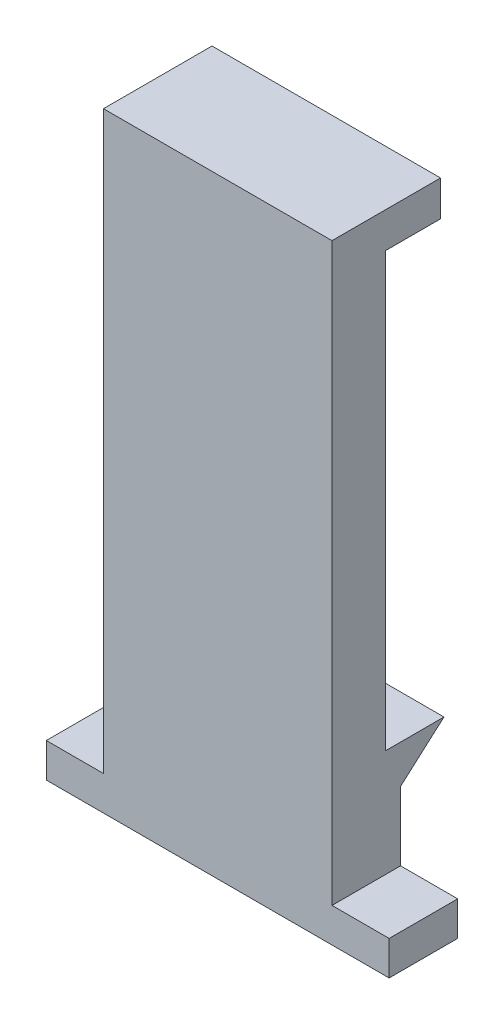
ISO-10303-21;
HEADER;
FILE_DESCRIPTION(('STEP AP214'),'2;1');
FILE_NAME('part.step','',(''),(''),'','','');
FILE_SCHEMA(('AUTOMOTIVE_DESIGN { 1 0 10303 214 1 1 1 1 }'));
ENDSEC;
DATA;
#1=APPLICATION_CONTEXT('core data for automotive mechanical design processes');
#2=APPLICATION_PROTOCOL_DEFINITION('international standard','automotive_design',2000,#1);
#3=PRODUCT_CONTEXT('',#1,'mechanical');
#4=PRODUCT('Part','Part','',(#3));
#5=PRODUCT_RELATED_PRODUCT_CATEGORY('part','',(#4));
#6=PRODUCT_DEFINITION_FORMATION('','',#4);
#7=PRODUCT_DEFINITION_CONTEXT('part definition',#1,'design');
#8=PRODUCT_DEFINITION('design','',#6,#7);
#9=PRODUCT_DEFINITION_SHAPE('','',#8);
#10=(LENGTH_UNIT() NAMED_UNIT(*) SI_UNIT(.MILLI.,.METRE.));
#11=(NAMED_UNIT(*) PLANE_ANGLE_UNIT() SI_UNIT($,.RADIAN.));
#12=(NAMED_UNIT(*) SI_UNIT($,.STERADIAN.) SOLID_ANGLE_UNIT());
#13=UNCERTAINTY_MEASURE_WITH_UNIT(LENGTH_MEASURE(1.E-05),#10,'distance_accuracy_value','');
#14=(GEOMETRIC_REPRESENTATION_CONTEXT(3) GLOBAL_UNCERTAINTY_ASSIGNED_CONTEXT((#13)) GLOBAL_UNIT_ASSIGNED_CONTEXT((#10,
#11,#12)) REPRESENTATION_CONTEXT('',''));
#15=CARTESIAN_POINT('',(0.,0.,0.));
#16=DIRECTION('',(0.,0.,1.));
#17=DIRECTION('',(1.,0.,0.));
#18=AXIS2_PLACEMENT_3D('',#15,#16,#17);
#19=CARTESIAN_POINT('',(20.,41.,0.300000000000007));
#20=DIRECTION('',(0.,-1.,0.));
#21=DIRECTION('',(0.,0.,-1.));
#22=AXIS2_PLACEMENT_3D('',#19,#20,#21);
#23=PLANE('',#22);
#24=DIRECTION('',(0.,0.,1.));
#25=VECTOR('',#24,1.);
#26=CARTESIAN_POINT('',(0.,41.,0.300000000000007));
#27=LINE('',#26,#25);
#28=CARTESIAN_POINT('',(0.,41.,0.300000000000007));
#29=VERTEX_POINT('',#28);
#30=CARTESIAN_POINT('',(0.,41.,9.80000000000001));
#31=VERTEX_POINT('',#30);
#32=EDGE_CURVE('E166',#29,#31,#27,.T.);
#33=ORIENTED_EDGE('',*,*,#32,.T.);
#34=DIRECTION('',(-1.,0.,0.));
#35=VECTOR('',#34,1.);
#36=CARTESIAN_POINT('',(20.,41.,9.80000000000001));
#37=LINE('',#36,#35);
#38=CARTESIAN_POINT('',(20.,41.,9.80000000000001));
#39=VERTEX_POINT('',#38);
#40=EDGE_CURVE('E46',#39,#31,#37,.T.);
#41=ORIENTED_EDGE('',*,*,#40,.F.);
#42=DIRECTION('',(0.,0.,1.));
#43=VECTOR('',#42,1.);
#44=CARTESIAN_POINT('',(20.,41.,0.300000000000007));
#45=LINE('',#44,#43);
#46=CARTESIAN_POINT('',(20.,41.,0.300000000000007));
#47=VERTEX_POINT('',#46);
#48=EDGE_CURVE('E168',#47,#39,#45,.T.);
#49=ORIENTED_EDGE('',*,*,#48,.F.);
#50=DIRECTION('',(-1.,0.,0.));
#51=VECTOR('',#50,1.);
#52=CARTESIAN_POINT('',(20.,41.,0.300000000000007));
#53=LINE('',#52,#51);
#54=EDGE_CURVE('E183',#47,#29,#53,.T.);
#55=ORIENTED_EDGE('',*,*,#54,.T.);
#56=EDGE_LOOP('',(#33,#41,#49,#55));
#57=FACE_BOUND('',#56,.T.);
#58=ADVANCED_FACE('F39',(#57),#23,.F.);
#59=CARTESIAN_POINT('',(20.,41.,9.80000000000001));
#60=DIRECTION('',(0.,0.,-1.));
#61=DIRECTION('',(0.,1.,0.));
#62=AXIS2_PLACEMENT_3D('',#59,#60,#61);
#63=PLANE('',#62);
#64=DIRECTION('',(0.,-1.,0.));
#65=VECTOR('',#64,1.);
#66=CARTESIAN_POINT('',(0.,41.,9.80000000000001));
#67=LINE('',#66,#65);
#68=CARTESIAN_POINT('',(0.,-9.38,9.8));
#69=VERTEX_POINT('',#68);
#70=EDGE_CURVE('E186',#31,#69,#67,.T.);
#71=ORIENTED_EDGE('',*,*,#70,.T.);
#72=DIRECTION('',(1.,0.,0.));
#73=VECTOR('',#72,1.);
#74=CARTESIAN_POINT('',(-5.,-9.38,9.8));
#75=LINE('',#74,#73);
#76=CARTESIAN_POINT('',(-5.,-9.38,9.8));
#77=VERTEX_POINT('',#76);
#78=EDGE_CURVE('E161',#77,#69,#75,.T.);
#79=ORIENTED_EDGE('',*,*,#78,.F.);
#80=DIRECTION('',(0.,-1.,0.));
#81=VECTOR('',#80,1.);
#82=CARTESIAN_POINT('',(-5.,-9.38,9.8));
#83=LINE('',#82,#81);
#84=CARTESIAN_POINT('',(-5.,-12.38,9.8));
#85=VERTEX_POINT('',#84);
#86=EDGE_CURVE('E158',#77,#85,#83,.T.);
#87=ORIENTED_EDGE('',*,*,#86,.T.);
#88=DIRECTION('',(-1.,0.,0.));
#89=VECTOR('',#88,1.);
#90=CARTESIAN_POINT('',(20.,-12.38,9.8));
#91=LINE('',#90,#89);
#92=CARTESIAN_POINT('',(25.,-12.38,9.8));
#93=VERTEX_POINT('',#92);
#94=EDGE_CURVE('E219',#93,#85,#91,.T.);
#95=ORIENTED_EDGE('',*,*,#94,.F.);
#96=DIRECTION('',(0.,-1.,0.));
#97=VECTOR('',#96,1.);
#98=CARTESIAN_POINT('',(25.,-9.38,9.8));
#99=LINE('',#98,#97);
#100=CARTESIAN_POINT('',(25.,-9.38,9.8));
#101=VERTEX_POINT('',#100);
#102=EDGE_CURVE('E155',#101,#93,#99,.T.);
#103=ORIENTED_EDGE('',*,*,#102,.F.);
#104=CARTESIAN_POINT('',(20.,-9.37999999999999,9.8));
#105=VERTEX_POINT('',#104);
#106=EDGE_CURVE('E147',#105,#101,#75,.T.);
#107=ORIENTED_EDGE('',*,*,#106,.F.);
#108=DIRECTION('',(0.,-1.,0.));
#109=VECTOR('',#108,1.);
#110=CARTESIAN_POINT('',(20.,41.,9.80000000000001));
#111=LINE('',#110,#109);
#112=EDGE_CURVE('E58',#39,#105,#111,.T.);
#113=ORIENTED_EDGE('',*,*,#112,.F.);
#114=ORIENTED_EDGE('',*,*,#40,.T.);
#115=EDGE_LOOP('',(#71,#79,#87,#95,#103,#107,#113,#114));
#116=FACE_BOUND('',#115,.T.);
#117=ADVANCED_FACE('F223',(#116),#63,.F.);
#118=CARTESIAN_POINT('',(20.,-12.38,9.8));
#119=DIRECTION('',(0.,1.,0.));
#120=DIRECTION('',(0.,0.,1.));
#121=AXIS2_PLACEMENT_3D('',#118,#119,#120);
#122=PLANE('',#121);
#123=ORIENTED_EDGE('',*,*,#94,.T.);
#124=DIRECTION('',(0.,0.,-1.));
#125=VECTOR('',#124,1.);
#126=CARTESIAN_POINT('',(-5.,-12.38,9.8));
#127=LINE('',#126,#125);
#128=CARTESIAN_POINT('',(-5.,-12.38,3.8));
#129=VERTEX_POINT('',#128);
#130=EDGE_CURVE('E141',#85,#129,#127,.T.);
#131=ORIENTED_EDGE('',*,*,#130,.T.);
#132=DIRECTION('',(-1.,0.,0.));
#133=VECTOR('',#132,1.);
#134=CARTESIAN_POINT('',(20.,-12.38,3.8));
#135=LINE('',#134,#133);
#136=CARTESIAN_POINT('',(25.,-12.38,3.8));
#137=VERTEX_POINT('',#136);
#138=EDGE_CURVE('E217',#137,#129,#135,.T.);
#139=ORIENTED_EDGE('',*,*,#138,.F.);
#140=DIRECTION('',(0.,0.,-1.));
#141=VECTOR('',#140,1.);
#142=CARTESIAN_POINT('',(25.,-12.38,9.8));
#143=LINE('',#142,#141);
#144=EDGE_CURVE('E154',#93,#137,#143,.T.);
#145=ORIENTED_EDGE('',*,*,#144,.F.);
#146=EDGE_LOOP('',(#123,#131,#139,#145));
#147=FACE_BOUND('',#146,.T.);
#148=ADVANCED_FACE('F251',(#147),#122,.F.);
#149=CARTESIAN_POINT('',(20.,-12.38,3.8));
#150=DIRECTION('',(0.,0.,1.));
#151=DIRECTION('',(0.,-1.,0.));
#152=AXIS2_PLACEMENT_3D('',#149,#150,#151);
#153=PLANE('',#152);
#154=DIRECTION('',(0.,1.,0.));
#155=VECTOR('',#154,1.);
#156=CARTESIAN_POINT('',(20.,-12.38,3.8));
#157=LINE('',#156,#155);
#158=CARTESIAN_POINT('',(20.,-9.38,3.8));
#159=VERTEX_POINT('',#158);
#160=CARTESIAN_POINT('',(20.,-3.3570820663189,3.8));
#161=VERTEX_POINT('',#160);
#162=EDGE_CURVE('E138',#159,#161,#157,.T.);
#163=ORIENTED_EDGE('',*,*,#162,.F.);
#164=DIRECTION('',(1.,0.,0.));
#165=VECTOR('',#164,1.);
#166=CARTESIAN_POINT('',(-5.,-9.38,3.8));
#167=LINE('',#166,#165);
#168=CARTESIAN_POINT('',(25.,-9.38,3.8));
#169=VERTEX_POINT('',#168);
#170=EDGE_CURVE('E131',#159,#169,#167,.T.);
#171=ORIENTED_EDGE('',*,*,#170,.T.);
#172=DIRECTION('',(0.,-1.,0.));
#173=VECTOR('',#172,1.);
#174=CARTESIAN_POINT('',(25.,-9.38,3.8));
#175=LINE('',#174,#173);
#176=EDGE_CURVE('E135',#169,#137,#175,.T.);
#177=ORIENTED_EDGE('',*,*,#176,.T.);
#178=ORIENTED_EDGE('',*,*,#138,.T.);
#179=DIRECTION('',(0.,-1.,0.));
#180=VECTOR('',#179,1.);
#181=CARTESIAN_POINT('',(-5.,-9.38,3.8));
#182=LINE('',#181,#180);
#183=CARTESIAN_POINT('',(-5.,-9.38,3.8));
#184=VERTEX_POINT('',#183);
#185=EDGE_CURVE('E167',#184,#129,#182,.T.);
#186=ORIENTED_EDGE('',*,*,#185,.F.);
#187=CARTESIAN_POINT('',(0.,-9.38,3.8));
#188=VERTEX_POINT('',#187);
#189=EDGE_CURVE('E140',#184,#188,#167,.T.);
#190=ORIENTED_EDGE('',*,*,#189,.T.);
#191=DIRECTION('',(0.,1.,0.));
#192=VECTOR('',#191,1.);
#193=CARTESIAN_POINT('',(0.,-12.38,3.8));
#194=LINE('',#193,#192);
#195=CARTESIAN_POINT('',(0.,-3.3570820663189,3.8));
#196=VERTEX_POINT('',#195);
#197=EDGE_CURVE('E189',#188,#196,#194,.T.);
#198=ORIENTED_EDGE('',*,*,#197,.T.);
#199=DIRECTION('',(-1.,0.,0.));
#200=VECTOR('',#199,1.);
#201=CARTESIAN_POINT('',(20.,-3.3570820663189,3.8));
#202=LINE('',#201,#200);
#203=EDGE_CURVE('E214',#161,#196,#202,.T.);
#204=ORIENTED_EDGE('',*,*,#203,.F.);
#205=EDGE_LOOP('',(#163,#171,#177,#178,#186,#190,#198,#204));
#206=FACE_BOUND('',#205,.T.);
#207=ADVANCED_FACE('F133',(#206),#153,.F.);
#208=CARTESIAN_POINT('',(20.,-3.3570820663189,3.8));
#209=DIRECTION('',(0.,0.749432561175129,0.662080687114861));
#210=DIRECTION('',(0.,-0.662080687114861,0.749432561175129));
#211=AXIS2_PLACEMENT_3D('',#208,#209,#210);
#212=PLANE('',#211);
#213=DIRECTION('',(0.,0.662080687114861,-0.749432561175129));
#214=VECTOR('',#213,1.);
#215=CARTESIAN_POINT('',(0.,-3.3570820663189,3.8));
#216=LINE('',#215,#214);
#217=CARTESIAN_POINT('',(0.,0.,0.));
#218=VERTEX_POINT('',#217);
#219=EDGE_CURVE('E191',#196,#218,#216,.T.);
#220=ORIENTED_EDGE('',*,*,#219,.T.);
#221=DIRECTION('',(-1.,0.,0.));
#222=VECTOR('',#221,1.);
#223=CARTESIAN_POINT('',(20.,0.,0.));
#224=LINE('',#223,#222);
#225=CARTESIAN_POINT('',(20.,0.,0.));
#226=VERTEX_POINT('',#225);
#227=EDGE_CURVE('E211',#226,#218,#224,.T.);
#228=ORIENTED_EDGE('',*,*,#227,.F.);
#229=DIRECTION('',(0.,0.662080687114861,-0.749432561175129));
#230=VECTOR('',#229,1.);
#231=CARTESIAN_POINT('',(20.,-3.3570820663189,3.8));
#232=LINE('',#231,#230);
#233=EDGE_CURVE('E173',#161,#226,#232,.T.);
#234=ORIENTED_EDGE('',*,*,#233,.F.);
#235=ORIENTED_EDGE('',*,*,#203,.T.);
#236=EDGE_LOOP('',(#220,#228,#234,#235));
#237=FACE_BOUND('',#236,.T.);
#238=ADVANCED_FACE('F258',(#237),#212,.F.);
#239=CARTESIAN_POINT('',(20.,0.,0.));
#240=DIRECTION('',(0.,-1.,0.));
#241=DIRECTION('',(0.,0.,-1.));
#242=AXIS2_PLACEMENT_3D('',#239,#240,#241);
#243=PLANE('',#242);
#244=DIRECTION('',(0.,0.,1.));
#245=VECTOR('',#244,1.);
#246=CARTESIAN_POINT('',(0.,0.,0.));
#247=LINE('',#246,#245);
#248=CARTESIAN_POINT('',(0.,0.,5.1));
#249=VERTEX_POINT('',#248);
#250=EDGE_CURVE('E193',#218,#249,#247,.T.);
#251=ORIENTED_EDGE('',*,*,#250,.T.);
#252=DIRECTION('',(-1.,0.,0.));
#253=VECTOR('',#252,1.);
#254=CARTESIAN_POINT('',(20.,0.,5.1));
#255=LINE('',#254,#253);
#256=CARTESIAN_POINT('',(20.,0.,5.1));
#257=VERTEX_POINT('',#256);
#258=EDGE_CURVE('E208',#257,#249,#255,.T.);
#259=ORIENTED_EDGE('',*,*,#258,.F.);
#260=DIRECTION('',(0.,0.,1.));
#261=VECTOR('',#260,1.);
#262=CARTESIAN_POINT('',(20.,0.,0.));
#263=LINE('',#262,#261);
#264=EDGE_CURVE('E175',#226,#257,#263,.T.);
#265=ORIENTED_EDGE('',*,*,#264,.F.);
#266=ORIENTED_EDGE('',*,*,#227,.T.);
#267=EDGE_LOOP('',(#251,#259,#265,#266));
#268=FACE_BOUND('',#267,.T.);
#269=ADVANCED_FACE('F271',(#268),#243,.F.);
#270=CARTESIAN_POINT('',(20.,0.,5.1));
#271=DIRECTION('',(0.,0.,1.));
#272=DIRECTION('',(1.,0.,0.));
#273=AXIS2_PLACEMENT_3D('',#270,#271,#272);
#274=PLANE('',#273);
#275=DIRECTION('',(0.,1.,0.));
#276=VECTOR('',#275,1.);
#277=CARTESIAN_POINT('',(0.,0.,5.1));
#278=LINE('',#277,#276);
#279=CARTESIAN_POINT('',(0.,37.9,5.1));
#280=VERTEX_POINT('',#279);
#281=EDGE_CURVE('E195',#249,#280,#278,.T.);
#282=ORIENTED_EDGE('',*,*,#281,.T.);
#283=DIRECTION('',(-1.,0.,0.));
#284=VECTOR('',#283,1.);
#285=CARTESIAN_POINT('',(20.,37.9,5.1));
#286=LINE('',#285,#284);
#287=CARTESIAN_POINT('',(20.,37.9,5.1));
#288=VERTEX_POINT('',#287);
#289=EDGE_CURVE('E205',#288,#280,#286,.T.);
#290=ORIENTED_EDGE('',*,*,#289,.F.);
#291=DIRECTION('',(0.,1.,0.));
#292=VECTOR('',#291,1.);
#293=CARTESIAN_POINT('',(20.,0.,5.1));
#294=LINE('',#293,#292);
#295=EDGE_CURVE('E177',#257,#288,#294,.T.);
#296=ORIENTED_EDGE('',*,*,#295,.F.);
#297=ORIENTED_EDGE('',*,*,#258,.T.);
#298=EDGE_LOOP('',(#282,#290,#296,#297));
#299=FACE_BOUND('',#298,.T.);
#300=ADVANCED_FACE('F281',(#299),#274,.F.);
#301=CARTESIAN_POINT('',(20.,37.9,5.1));
#302=DIRECTION('',(0.,1.,0.));
#303=DIRECTION('',(0.,0.,1.));
#304=AXIS2_PLACEMENT_3D('',#301,#302,#303);
#305=PLANE('',#304);
#306=DIRECTION('',(0.,0.,-1.));
#307=VECTOR('',#306,1.);
#308=CARTESIAN_POINT('',(0.,37.9,5.1));
#309=LINE('',#308,#307);
#310=CARTESIAN_POINT('',(0.,37.9,0.300000000000007));
#311=VERTEX_POINT('',#310);
#312=EDGE_CURVE('E197',#280,#311,#309,.T.);
#313=ORIENTED_EDGE('',*,*,#312,.T.);
#314=DIRECTION('',(-1.,0.,0.));
#315=VECTOR('',#314,1.);
#316=CARTESIAN_POINT('',(20.,37.9,0.300000000000007));
#317=LINE('',#316,#315);
#318=CARTESIAN_POINT('',(20.,37.9,0.300000000000007));
#319=VERTEX_POINT('',#318);
#320=EDGE_CURVE('E202',#319,#311,#317,.T.);
#321=ORIENTED_EDGE('',*,*,#320,.F.);
#322=DIRECTION('',(0.,0.,-1.));
#323=VECTOR('',#322,1.);
#324=CARTESIAN_POINT('',(20.,37.9,5.1));
#325=LINE('',#324,#323);
#326=EDGE_CURVE('E179',#288,#319,#325,.T.);
#327=ORIENTED_EDGE('',*,*,#326,.F.);
#328=ORIENTED_EDGE('',*,*,#289,.T.);
#329=EDGE_LOOP('',(#313,#321,#327,#328));
#330=FACE_BOUND('',#329,.T.);
#331=ADVANCED_FACE('F290',(#330),#305,.F.);
#332=CARTESIAN_POINT('',(20.,37.9,0.300000000000007));
#333=DIRECTION('',(0.,0.,1.));
#334=DIRECTION('',(1.,0.,0.));
#335=AXIS2_PLACEMENT_3D('',#332,#333,#334);
#336=PLANE('',#335);
#337=DIRECTION('',(0.,1.,0.));
#338=VECTOR('',#337,1.);
#339=CARTESIAN_POINT('',(0.,37.9,0.300000000000007));
#340=LINE('',#339,#338);
#341=EDGE_CURVE('E170',#311,#29,#340,.T.);
#342=ORIENTED_EDGE('',*,*,#341,.T.);
#343=ORIENTED_EDGE('',*,*,#54,.F.);
#344=DIRECTION('',(0.,1.,0.));
#345=VECTOR('',#344,1.);
#346=CARTESIAN_POINT('',(20.,37.9,0.300000000000007));
#347=LINE('',#346,#345);
#348=EDGE_CURVE('E181',#319,#47,#347,.T.);
#349=ORIENTED_EDGE('',*,*,#348,.F.);
#350=ORIENTED_EDGE('',*,*,#320,.T.);
#351=EDGE_LOOP('',(#342,#343,#349,#350));
#352=FACE_BOUND('',#351,.T.);
#353=ADVANCED_FACE('F299',(#352),#336,.F.);
#354=CARTESIAN_POINT('',(20.,0.,0.));
#355=DIRECTION('',(1.,0.,0.));
#356=DIRECTION('',(0.,0.,-1.));
#357=AXIS2_PLACEMENT_3D('',#354,#355,#356);
#358=PLANE('',#357);
#359=DIRECTION('',(0.,0.,1.));
#360=VECTOR('',#359,1.);
#361=CARTESIAN_POINT('',(20.,-9.38,0.));
#362=LINE('',#361,#360);
#363=EDGE_CURVE('E53',#159,#105,#362,.T.);
#364=ORIENTED_EDGE('',*,*,#363,.F.);
#365=ORIENTED_EDGE('',*,*,#162,.T.);
#366=ORIENTED_EDGE('',*,*,#233,.T.);
#367=ORIENTED_EDGE('',*,*,#264,.T.);
#368=ORIENTED_EDGE('',*,*,#295,.T.);
#369=ORIENTED_EDGE('',*,*,#326,.T.);
#370=ORIENTED_EDGE('',*,*,#348,.T.);
#371=ORIENTED_EDGE('',*,*,#48,.T.);
#372=ORIENTED_EDGE('',*,*,#112,.T.);
#373=EDGE_LOOP('',(#364,#365,#366,#367,#368,#369,#370,#371,#372));
#374=FACE_BOUND('',#373,.T.);
#375=ADVANCED_FACE('F307',(#374),#358,.T.);
#376=CARTESIAN_POINT('',(0.,0.,0.));
#377=DIRECTION('',(1.,0.,0.));
#378=DIRECTION('',(0.,0.,-1.));
#379=AXIS2_PLACEMENT_3D('',#376,#377,#378);
#380=PLANE('',#379);
#381=ORIENTED_EDGE('',*,*,#197,.F.);
#382=DIRECTION('',(0.,0.,1.));
#383=VECTOR('',#382,1.);
#384=CARTESIAN_POINT('',(0.,-9.38,0.));
#385=LINE('',#384,#383);
#386=EDGE_CURVE('E11',#188,#69,#385,.T.);
#387=ORIENTED_EDGE('',*,*,#386,.T.);
#388=ORIENTED_EDGE('',*,*,#70,.F.);
#389=ORIENTED_EDGE('',*,*,#32,.F.);
#390=ORIENTED_EDGE('',*,*,#341,.F.);
#391=ORIENTED_EDGE('',*,*,#312,.F.);
#392=ORIENTED_EDGE('',*,*,#281,.F.);
#393=ORIENTED_EDGE('',*,*,#250,.F.);
#394=ORIENTED_EDGE('',*,*,#219,.F.);
#395=EDGE_LOOP('',(#381,#387,#388,#389,#390,#391,#392,#393,#394));
#396=FACE_BOUND('',#395,.T.);
#397=ADVANCED_FACE('F232',(#396),#380,.F.);
#398=CARTESIAN_POINT('',(-5.,-9.38,9.8));
#399=DIRECTION('',(-1.,0.,0.));
#400=DIRECTION('',(0.,0.,1.));
#401=AXIS2_PLACEMENT_3D('',#398,#399,#400);
#402=PLANE('',#401);
#403=ORIENTED_EDGE('',*,*,#130,.F.);
#404=ORIENTED_EDGE('',*,*,#86,.F.);
#405=DIRECTION('',(0.,0.,-1.));
#406=VECTOR('',#405,1.);
#407=CARTESIAN_POINT('',(-5.,-9.38,9.8));
#408=LINE('',#407,#406);
#409=EDGE_CURVE('E156',#77,#184,#408,.T.);
#410=ORIENTED_EDGE('',*,*,#409,.T.);
#411=ORIENTED_EDGE('',*,*,#185,.T.);
#412=EDGE_LOOP('',(#403,#404,#410,#411));
#413=FACE_BOUND('',#412,.T.);
#414=ADVANCED_FACE('F249',(#413),#402,.T.);
#415=CARTESIAN_POINT('',(0.,-9.38,0.));
#416=DIRECTION('',(0.,1.,0.));
#417=DIRECTION('',(0.,0.,1.));
#418=AXIS2_PLACEMENT_3D('',#415,#416,#417);
#419=PLANE('',#418);
#420=ORIENTED_EDGE('',*,*,#386,.F.);
#421=ORIENTED_EDGE('',*,*,#189,.F.);
#422=ORIENTED_EDGE('',*,*,#409,.F.);
#423=ORIENTED_EDGE('',*,*,#78,.T.);
#424=EDGE_LOOP('',(#420,#421,#422,#423));
#425=FACE_BOUND('',#424,.T.);
#426=ADVANCED_FACE('F238',(#425),#419,.T.);
#427=CARTESIAN_POINT('',(25.,-9.38,9.8));
#428=DIRECTION('',(-1.,0.,0.));
#429=DIRECTION('',(0.,0.,1.));
#430=AXIS2_PLACEMENT_3D('',#427,#428,#429);
#431=PLANE('',#430);
#432=ORIENTED_EDGE('',*,*,#144,.T.);
#433=ORIENTED_EDGE('',*,*,#176,.F.);
#434=DIRECTION('',(0.,0.,-1.));
#435=VECTOR('',#434,1.);
#436=CARTESIAN_POINT('',(25.,-9.38,9.8));
#437=LINE('',#436,#435);
#438=EDGE_CURVE('E144',#101,#169,#437,.T.);
#439=ORIENTED_EDGE('',*,*,#438,.F.);
#440=ORIENTED_EDGE('',*,*,#102,.T.);
#441=EDGE_LOOP('',(#432,#433,#439,#440));
#442=FACE_BOUND('',#441,.T.);
#443=ADVANCED_FACE('F152',(#442),#431,.F.);
#444=ORIENTED_EDGE('',*,*,#170,.F.);
#445=ORIENTED_EDGE('',*,*,#363,.T.);
#446=ORIENTED_EDGE('',*,*,#106,.T.);
#447=ORIENTED_EDGE('',*,*,#438,.T.);
#448=EDGE_LOOP('',(#444,#445,#446,#447));
#449=FACE_BOUND('',#448,.T.);
#450=ADVANCED_FACE('F145',(#449),#419,.T.);
#451=CLOSED_SHELL('',(#58,#117,#148,#207,#238,#269,#300,#331,#353,#375,#397,#414,#426,#443,#450));
#452=MANIFOLD_SOLID_BREP('B2',#451);
#453=ADVANCED_BREP_SHAPE_REPRESENTATION('',(#18,#452),#14);
#454=SHAPE_DEFINITION_REPRESENTATION(#9,#453);
ENDSEC;
END-ISO-10303-21;
